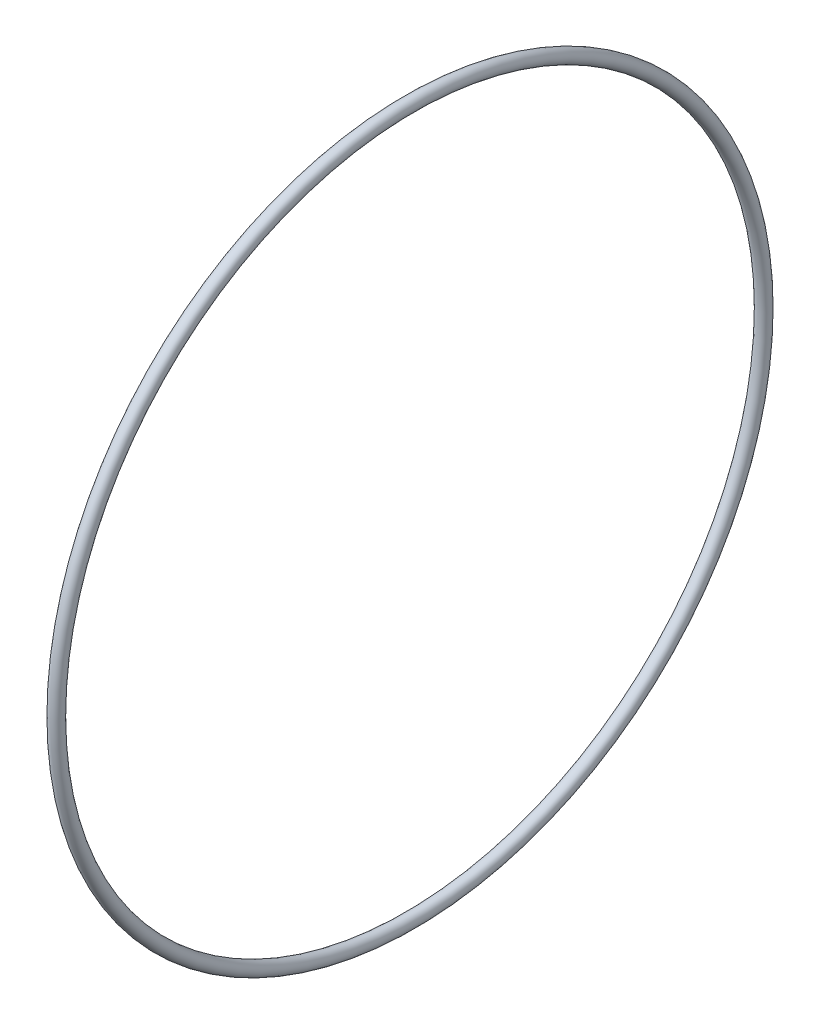
ISO-10303-21;
HEADER;
FILE_DESCRIPTION(('STEP AP214'),'2;1');
FILE_NAME('part.step','',(''),(''),'','','');
FILE_SCHEMA(('AUTOMOTIVE_DESIGN { 1 0 10303 214 1 1 1 1 }'));
ENDSEC;
DATA;
#1=APPLICATION_CONTEXT('core data for automotive mechanical design processes');
#2=APPLICATION_PROTOCOL_DEFINITION('international standard','automotive_design',2000,#1);
#3=PRODUCT_CONTEXT('',#1,'mechanical');
#4=PRODUCT('Part','Part','',(#3));
#5=PRODUCT_RELATED_PRODUCT_CATEGORY('part','',(#4));
#6=PRODUCT_DEFINITION_FORMATION('','',#4);
#7=PRODUCT_DEFINITION_CONTEXT('part definition',#1,'design');
#8=PRODUCT_DEFINITION('design','',#6,#7);
#9=PRODUCT_DEFINITION_SHAPE('','',#8);
#10=(LENGTH_UNIT() NAMED_UNIT(*) SI_UNIT(.MILLI.,.METRE.));
#11=(NAMED_UNIT(*) PLANE_ANGLE_UNIT() SI_UNIT($,.RADIAN.));
#12=(NAMED_UNIT(*) SI_UNIT($,.STERADIAN.) SOLID_ANGLE_UNIT());
#13=UNCERTAINTY_MEASURE_WITH_UNIT(LENGTH_MEASURE(1.E-05),#10,'distance_accuracy_value','');
#14=(GEOMETRIC_REPRESENTATION_CONTEXT(3) GLOBAL_UNCERTAINTY_ASSIGNED_CONTEXT((#13)) GLOBAL_UNIT_ASSIGNED_CONTEXT((#10,
#11,#12)) REPRESENTATION_CONTEXT('',''));
#15=CARTESIAN_POINT('',(0.,0.,0.));
#16=DIRECTION('',(0.,0.,1.));
#17=DIRECTION('',(1.,0.,0.));
#18=AXIS2_PLACEMENT_3D('',#15,#16,#17);
#19=CARTESIAN_POINT('',(0.,0.,0.));
#20=DIRECTION('',(-1.,0.,0.));
#21=DIRECTION('',(0.,0.,1.));
#22=AXIS2_PLACEMENT_3D('',#19,#20,#21);
#23=TOROIDAL_SURFACE('',#22,142.0495,2.66700000000001);
#24=CARTESIAN_POINT('',(0.,0.,144.7165));
#25=VERTEX_POINT('',#24);
#26=VERTEX_LOOP('',#25);
#27=FACE_BOUND('',#26,.T.);
#28=ADVANCED_FACE('F28',(#27),#23,.T.);
#29=CLOSED_SHELL('',(#28));
#30=MANIFOLD_SOLID_BREP('B2',#29);
#31=ADVANCED_BREP_SHAPE_REPRESENTATION('',(#18,#30),#14);
#32=SHAPE_DEFINITION_REPRESENTATION(#9,#31);
ENDSEC;
END-ISO-10303-21;
